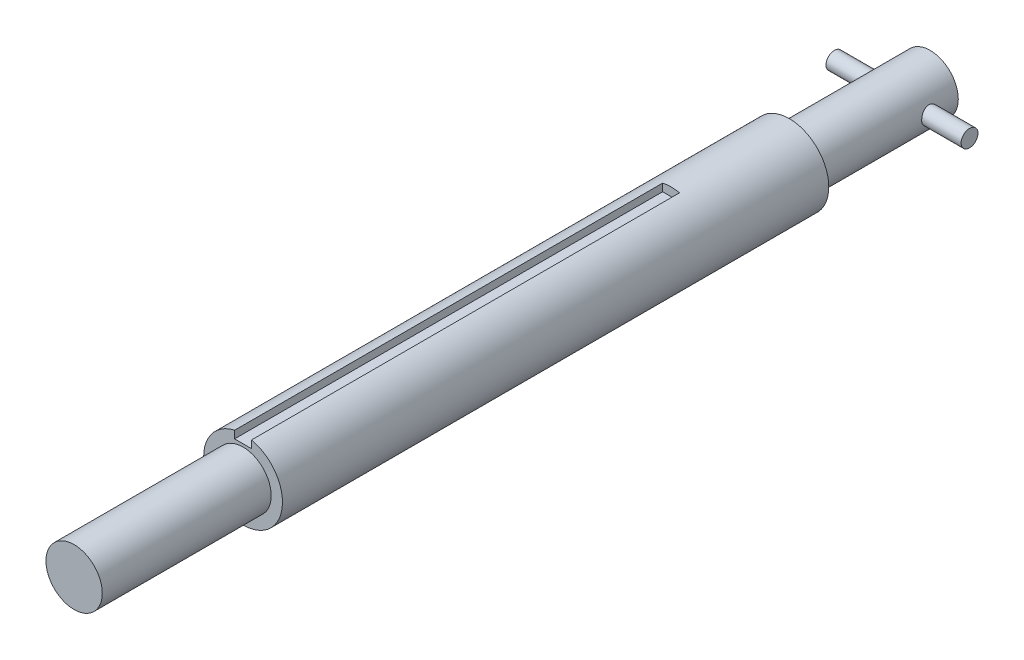
ISO-10303-21;
HEADER;
FILE_DESCRIPTION(('STEP AP214'),'2;1');
FILE_NAME('part.step','',(''),(''),'','','');
FILE_SCHEMA(('AUTOMOTIVE_DESIGN { 1 0 10303 214 1 1 1 1 }'));
ENDSEC;
DATA;
#1=APPLICATION_CONTEXT('core data for automotive mechanical design processes');
#2=APPLICATION_PROTOCOL_DEFINITION('international standard','automotive_design',2000,#1);
#3=PRODUCT_CONTEXT('',#1,'mechanical');
#4=PRODUCT('Part','Part','',(#3));
#5=PRODUCT_RELATED_PRODUCT_CATEGORY('part','',(#4));
#6=PRODUCT_DEFINITION_FORMATION('','',#4);
#7=PRODUCT_DEFINITION_CONTEXT('part definition',#1,'design');
#8=PRODUCT_DEFINITION('design','',#6,#7);
#9=PRODUCT_DEFINITION_SHAPE('','',#8);
#10=(LENGTH_UNIT() NAMED_UNIT(*) SI_UNIT(.MILLI.,.METRE.));
#11=(NAMED_UNIT(*) PLANE_ANGLE_UNIT() SI_UNIT($,.RADIAN.));
#12=(NAMED_UNIT(*) SI_UNIT($,.STERADIAN.) SOLID_ANGLE_UNIT());
#13=UNCERTAINTY_MEASURE_WITH_UNIT(LENGTH_MEASURE(1.E-05),#10,'distance_accuracy_value','');
#14=(GEOMETRIC_REPRESENTATION_CONTEXT(3) GLOBAL_UNCERTAINTY_ASSIGNED_CONTEXT((#13)) GLOBAL_UNIT_ASSIGNED_CONTEXT((#10,
#11,#12)) REPRESENTATION_CONTEXT('',''));
#15=CARTESIAN_POINT('',(0.,0.,0.));
#16=DIRECTION('',(0.,0.,1.));
#17=DIRECTION('',(1.,0.,0.));
#18=AXIS2_PLACEMENT_3D('',#15,#16,#17);
#19=CARTESIAN_POINT('',(-12.,0.,5.));
#20=DIRECTION('',(1.,0.,0.));
#21=DIRECTION('',(0.,0.,-1.));
#22=AXIS2_PLACEMENT_3D('',#19,#20,#21);
#23=CYLINDRICAL_SURFACE('',#22,1.5);
#24=CARTESIAN_POINT('',(-12.,0.,5.));
#25=DIRECTION('',(1.,0.,0.));
#26=DIRECTION('',(0.,0.,-1.));
#27=AXIS2_PLACEMENT_3D('',#24,#25,#26);
#28=CIRCLE('',#27,1.5);
#29=CARTESIAN_POINT('',(-12.,0.,3.5));
#30=VERTEX_POINT('',#29);
#31=EDGE_CURVE('E11',#30,#30,#28,.T.);
#32=ORIENTED_EDGE('',*,*,#31,.T.);
#33=EDGE_LOOP('',(#32));
#34=FACE_BOUND('',#33,.T.);
#35=CARTESIAN_POINT('',(12.,0.,5.));
#36=DIRECTION('',(1.,0.,0.));
#37=DIRECTION('',(0.,0.,-1.));
#38=AXIS2_PLACEMENT_3D('',#35,#36,#37);
#39=CIRCLE('',#38,1.5);
#40=CARTESIAN_POINT('',(12.,0.,3.5));
#41=VERTEX_POINT('',#40);
#42=EDGE_CURVE('E51',#41,#41,#39,.T.);
#43=ORIENTED_EDGE('',*,*,#42,.F.);
#44=EDGE_LOOP('',(#43));
#45=FACE_BOUND('',#44,.T.);
#46=ADVANCED_FACE('F45',(#34,#45),#23,.T.);
#47=CARTESIAN_POINT('',(-12.,0.,5.));
#48=DIRECTION('',(1.,0.,0.));
#49=DIRECTION('',(0.,0.,-1.));
#50=AXIS2_PLACEMENT_3D('',#47,#48,#49);
#51=PLANE('',#50);
#52=ORIENTED_EDGE('',*,*,#31,.F.);
#53=EDGE_LOOP('',(#52));
#54=FACE_BOUND('',#53,.T.);
#55=ADVANCED_FACE('F60',(#54),#51,.F.);
#56=CARTESIAN_POINT('',(12.,0.,5.));
#57=DIRECTION('',(1.,0.,0.));
#58=DIRECTION('',(0.,0.,-1.));
#59=AXIS2_PLACEMENT_3D('',#56,#57,#58);
#60=PLANE('',#59);
#61=ORIENTED_EDGE('',*,*,#42,.T.);
#62=EDGE_LOOP('',(#61));
#63=FACE_BOUND('',#62,.T.);
#64=ADVANCED_FACE('F57',(#63),#60,.T.);
#65=CLOSED_SHELL('',(#46,#55,#64));
#66=MANIFOLD_SOLID_BREP('B2',#65);
#67=CARTESIAN_POINT('',(0.,0.,25.));
#68=DIRECTION('',(0.,0.,-1.));
#69=DIRECTION('',(-1.,0.,0.));
#70=AXIS2_PLACEMENT_3D('',#67,#68,#69);
#71=CYLINDRICAL_SURFACE('',#70,5.);
#72=CARTESIAN_POINT('',(-5.,0.,6.5));
#73=CARTESIAN_POINT('',(-4.9999992925055,-0.0822886127532999,6.49999900251512));
#74=CARTESIAN_POINT('',(-4.99794915693953,-0.164587318351529,6.49320613637603));
#75=CARTESIAN_POINT('',(-4.98997105593691,-0.326788125304881,6.4662786457779));
#76=CARTESIAN_POINT('',(-4.98404193389692,-0.40668950441142,6.44614004197666));
#77=CARTESIAN_POINT('',(-4.96895552501836,-0.561732707754526,6.39325398308974));
#78=CARTESIAN_POINT('',(-4.95980300250425,-0.636881364395373,6.36052513038106));
#79=CARTESIAN_POINT('',(-4.93922109237645,-0.780624181053131,6.28346390694417));
#80=CARTESIAN_POINT('',(-4.92779140192067,-0.849217467469669,6.23912999260458));
#81=CARTESIAN_POINT('',(-4.90350737192774,-0.979871797183745,6.13877599252733));
#82=CARTESIAN_POINT('',(-4.89062383657036,-1.04171807124434,6.08248337411409));
#83=CARTESIAN_POINT('',(-4.86505834210442,-1.15524920923324,5.96039077008982));
#84=CARTESIAN_POINT('',(-4.85237641724501,-1.20693236327441,5.89458918787504));
#85=CARTESIAN_POINT('',(-4.82834113993772,-1.29980037723708,5.75352924696239));
#86=CARTESIAN_POINT('',(-4.81702406663875,-1.34072309022213,5.67809153900926));
#87=CARTESIAN_POINT('',(-4.79743620394031,-1.4092139477476,5.52101074576971));
#88=CARTESIAN_POINT('',(-4.78916468313311,-1.43678529919973,5.43936915607203));
#89=CARTESIAN_POINT('',(-4.77690870838434,-1.47701633682652,5.27460973386954));
#90=CARTESIAN_POINT('',(-4.77281069324533,-1.49007196234677,5.19159725613606));
#91=CARTESIAN_POINT('',(-4.76902789749767,-1.50213730614672,5.02446684378324));
#92=CARTESIAN_POINT('',(-4.76934204760571,-1.50115042761078,4.94034918194092));
#93=CARTESIAN_POINT('',(-4.77424744067778,-1.48546977199812,4.77661609139152));
#94=CARTESIAN_POINT('',(-4.7786838859914,-1.47127205262685,4.69694774963776));
#95=CARTESIAN_POINT('',(-4.79108356228624,-1.43037420427056,4.54118021372654));
#96=CARTESIAN_POINT('',(-4.7990471413235,-1.40367284141641,4.46508137262567));
#97=CARTESIAN_POINT('',(-4.81772733074973,-1.33816026653682,4.31739965033926));
#98=CARTESIAN_POINT('',(-4.82848016115952,-1.29918816934643,4.24589291604474));
#99=CARTESIAN_POINT('',(-4.85150987000064,-1.21035222588683,4.11026797798981));
#100=CARTESIAN_POINT('',(-4.86378711746991,-1.16048574002588,4.04615157058622));
#101=CARTESIAN_POINT('',(-4.88911011297937,-1.04881290765546,3.92431380923798));
#102=CARTESIAN_POINT('',(-4.90216654310498,-0.986594907466973,3.86697133597033));
#103=CARTESIAN_POINT('',(-4.92712244063258,-0.853263259313968,3.76344601593575));
#104=CARTESIAN_POINT('',(-4.9390218351841,-0.782149051860888,3.71726387158557));
#105=CARTESIAN_POINT('',(-4.9604316006947,-0.632355038342803,3.63714007753527));
#106=CARTESIAN_POINT('',(-4.96992543668314,-0.553627749747951,3.60328248375014));
#107=CARTESIAN_POINT('',(-4.98533521832222,-0.39124541560352,3.54940040990037));
#108=CARTESIAN_POINT('',(-4.99125216186999,-0.307591751589582,3.52937207146751));
#109=CARTESIAN_POINT('',(-4.99868364643538,-0.140952242668332,3.50434782210061));
#110=CARTESIAN_POINT('',(-5.0003485041779,-0.0580500976011875,3.49883841419839));
#111=CARTESIAN_POINT('',(-4.99952923241759,0.107499605823382,3.50156915571208));
#112=CARTESIAN_POINT('',(-4.99704565677756,0.19014719669078,3.50980746965144));
#113=CARTESIAN_POINT('',(-4.98830696987163,0.350903605309696,3.5393846111115));
#114=CARTESIAN_POINT('',(-4.98213829799417,0.429072772614169,3.56042338758087));
#115=CARTESIAN_POINT('',(-4.96674347841532,0.580754638954521,3.6146432327782));
#116=CARTESIAN_POINT('',(-4.95751696321085,0.654266777025583,3.64782576103786));
#117=CARTESIAN_POINT('',(-4.93669654351325,0.796437189461052,3.72625316548113));
#118=CARTESIAN_POINT('',(-4.92505280829675,0.86494382619967,3.77175934094797));
#119=CARTESIAN_POINT('',(-4.90073468764317,0.993523307980147,3.87322475405281));
#120=CARTESIAN_POINT('',(-4.8880600443108,1.05359403235593,3.92918661188767));
#121=CARTESIAN_POINT('',(-4.86253171869138,1.16585744551027,4.05238730836935));
#122=CARTESIAN_POINT('',(-4.84968825033268,1.21768481231503,4.11996187577174));
#123=CARTESIAN_POINT('',(-4.82576515238463,1.30928995072154,4.26312793901353));
#124=CARTESIAN_POINT('',(-4.81468547654651,1.34906803829472,4.33871922455821));
#125=CARTESIAN_POINT('',(-4.79567189615055,1.41517347127168,4.49553249125469));
#126=CARTESIAN_POINT('',(-4.78772337843827,1.4415634693705,4.57672618653659));
#127=CARTESIAN_POINT('',(-4.77591594362794,1.48021730815114,4.74268796893148));
#128=CARTESIAN_POINT('',(-4.772055625083,1.49248598978779,4.82745482078767));
#129=CARTESIAN_POINT('',(-4.76899972496087,1.50221984485059,4.99436151837623));
#130=CARTESIAN_POINT('',(-4.76961647442754,1.5002805530849,5.07646365101759));
#131=CARTESIAN_POINT('',(-4.77499401288294,1.48307505444813,5.2391141033728));
#132=CARTESIAN_POINT('',(-4.77975463592551,1.46780938124716,5.31966248517635));
#133=CARTESIAN_POINT('',(-4.79275763670385,1.42476888804136,5.47594539914285));
#134=CARTESIAN_POINT('',(-4.80095604545964,1.39715175507069,5.55172728736169));
#135=CARTESIAN_POINT('',(-4.81990278909136,1.33031507121129,5.69764243881772));
#136=CARTESIAN_POINT('',(-4.83065161194312,1.29109329962876,5.76777461764076));
#137=CARTESIAN_POINT('',(-4.85397676425833,1.20048763805072,5.90316311652711));
#138=CARTESIAN_POINT('',(-4.86660540163798,1.14871276092994,5.96814876126041));
#139=CARTESIAN_POINT('',(-4.89201320450026,1.03517434629782,6.08870249830786));
#140=CARTESIAN_POINT('',(-4.90479240823905,0.973408217134502,6.14426813946776));
#141=CARTESIAN_POINT('',(-4.92950936570649,0.83946576218325,6.24602341229503));
#142=CARTESIAN_POINT('',(-4.94141159765674,0.767037885790609,6.29189144685549));
#143=CARTESIAN_POINT('',(-4.96260680455813,0.61514137398353,6.37073516990403));
#144=CARTESIAN_POINT('',(-4.97190099931066,0.535676052998956,6.40371688827451));
#145=CARTESIAN_POINT('',(-4.98602174969301,0.380757712655282,6.45289527565275));
#146=CARTESIAN_POINT('',(-4.99122027381067,0.305786961954234,6.47051167288325));
#147=CARTESIAN_POINT('',(-4.99820944494492,0.15388019523078,6.49406352524158));
#148=CARTESIAN_POINT('',(-5.0000006615474,0.0769445098581397,6.50000093270482));
#149=CARTESIAN_POINT('',(-5.,0.,6.5));
#150=B_SPLINE_CURVE_WITH_KNOTS('',3,(#72,#73,#74,#75,#76,#77,#78,#79,#80,#81,#82,#83,#84,#85,
#86,#87,#88,#89,#90,#91,#92,#93,#94,#95,#96,#97,#98,#99,#100,#101,#102,#103,#104,#105,#106,#107,
#108,#109,#110,#111,#112,#113,#114,#115,#116,#117,#118,#119,#120,#121,#122,#123,#124,#125,#126,
#127,#128,#129,#130,#131,#132,#133,#134,#135,#136,#137,#138,#139,#140,#141,#142,#143,#144,#145,
#146,#147,#148,#149),.UNSPECIFIED.,.T.,.F.,(4,2,2,2,2,2,2,2,2,2,2,2,2,2,2,2,2,2,2,2,2,2,2,2,2,2,
2,2,2,2,2,2,2,2,2,2,2,2,4),(0.,0.24658320361261,0.493239964845999,0.739533676300874,
0.985860164412701,1.23855602948191,1.49129437288633,1.74971481004109,2.00807314543224,
2.25919689356599,2.51025978319089,2.75226016697676,2.99428443658001,3.2396242644712,
3.48502360158555,3.74067104048167,3.99633456531072,4.25371046881689,4.51101453528808,
4.75908809438545,5.00712853550327,5.24956746682327,5.49203554593729,5.74011305702909,
5.98825282000191,6.24540400322819,6.50254844252681,6.75847814951252,7.01432009460283,
7.25950155466943,7.504673196616,7.74680040402721,7.98897397553107,8.23996925679931,
8.49102974897503,8.74942996156671,9.00770911595235,9.2383169193046,9.46888616948875),.UNSPECIFIED.);
#151=CARTESIAN_POINT('',(-5.,0.,6.5));
#152=VERTEX_POINT('',#151);
#153=EDGE_CURVE('E96',#152,#152,#150,.T.);
#154=ORIENTED_EDGE('',*,*,#153,.T.);
#155=EDGE_LOOP('',(#154));
#156=FACE_BOUND('',#155,.T.);
#157=CARTESIAN_POINT('',(5.,0.,3.5));
#158=CARTESIAN_POINT('',(4.9999992925055,-0.0822886127533,3.50000099748489));
#159=CARTESIAN_POINT('',(4.99794915693953,-0.164587318351529,3.50679386362397));
#160=CARTESIAN_POINT('',(4.98997105593691,-0.326788125304881,3.5337213542221));
#161=CARTESIAN_POINT('',(4.98404193389692,-0.40668950441142,3.55385995802334));
#162=CARTESIAN_POINT('',(4.96895552501836,-0.561732707754527,3.60674601691026));
#163=CARTESIAN_POINT('',(4.95980300250425,-0.636881364395373,3.63947486961894));
#164=CARTESIAN_POINT('',(4.93922109237645,-0.780624181053132,3.71653609305584));
#165=CARTESIAN_POINT('',(4.92779140192067,-0.84921746746967,3.76087000739542));
#166=CARTESIAN_POINT('',(4.90350737192774,-0.979871797183745,3.86122400747267));
#167=CARTESIAN_POINT('',(4.89062383657036,-1.04171807124434,3.91751662588591));
#168=CARTESIAN_POINT('',(4.86505834210442,-1.15524920923324,4.03960922991018));
#169=CARTESIAN_POINT('',(4.85237641724501,-1.20693236327441,4.10541081212496));
#170=CARTESIAN_POINT('',(4.82834113993772,-1.29980037723708,4.24647075303761));
#171=CARTESIAN_POINT('',(4.81702406663875,-1.34072309022213,4.32190846099074));
#172=CARTESIAN_POINT('',(4.79743620394031,-1.4092139477476,4.47898925423029));
#173=CARTESIAN_POINT('',(4.78916468313311,-1.43678529919973,4.56063084392798));
#174=CARTESIAN_POINT('',(4.77690870838434,-1.47701633682652,4.72539026613046));
#175=CARTESIAN_POINT('',(4.77281069324533,-1.49007196234677,4.80840274386394));
#176=CARTESIAN_POINT('',(4.76902789749767,-1.50213730614672,4.97553315621677));
#177=CARTESIAN_POINT('',(4.76934204760571,-1.50115042761078,5.05965081805909));
#178=CARTESIAN_POINT('',(4.77424744067778,-1.48546977199812,5.22338390860848));
#179=CARTESIAN_POINT('',(4.7786838859914,-1.47127205262685,5.30305225036224));
#180=CARTESIAN_POINT('',(4.79108356228624,-1.43037420427056,5.45881978627346));
#181=CARTESIAN_POINT('',(4.7990471413235,-1.40367284141641,5.53491862737433));
#182=CARTESIAN_POINT('',(4.81772733074973,-1.33816026653682,5.68260034966074));
#183=CARTESIAN_POINT('',(4.82848016115952,-1.29918816934643,5.75410708395526));
#184=CARTESIAN_POINT('',(4.85150987000064,-1.21035222588683,5.88973202201019));
#185=CARTESIAN_POINT('',(4.86378711746991,-1.16048574002588,5.95384842941378));
#186=CARTESIAN_POINT('',(4.88911011297937,-1.04881290765546,6.07568619076202));
#187=CARTESIAN_POINT('',(4.90216654310498,-0.986594907466972,6.13302866402967));
#188=CARTESIAN_POINT('',(4.92712244063258,-0.853263259313967,6.23655398406425));
#189=CARTESIAN_POINT('',(4.9390218351841,-0.782149051860888,6.28273612841443));
#190=CARTESIAN_POINT('',(4.9604316006947,-0.632355038342803,6.36285992246473));
#191=CARTESIAN_POINT('',(4.96992543668314,-0.553627749747951,6.39671751624986));
#192=CARTESIAN_POINT('',(4.98533521832222,-0.391245415603519,6.45059959009963));
#193=CARTESIAN_POINT('',(4.99125216186999,-0.307591751589582,6.47062792853249));
#194=CARTESIAN_POINT('',(4.99868364643538,-0.140952242668332,6.4956521778994));
#195=CARTESIAN_POINT('',(5.0003485041779,-0.0580500976011873,6.50116158580161));
#196=CARTESIAN_POINT('',(4.99952923241759,0.107499605823383,6.49843084428792));
#197=CARTESIAN_POINT('',(4.99704565677756,0.19014719669078,6.49019253034856));
#198=CARTESIAN_POINT('',(4.98830696987163,0.350903605309697,6.46061538888851));
#199=CARTESIAN_POINT('',(4.98213829799417,0.429072772614169,6.43957661241913));
#200=CARTESIAN_POINT('',(4.96674347841532,0.580754638954522,6.3853567672218));
#201=CARTESIAN_POINT('',(4.95751696321085,0.654266777025584,6.35217423896214));
#202=CARTESIAN_POINT('',(4.93669654351325,0.796437189461053,6.27374683451887));
#203=CARTESIAN_POINT('',(4.92505280829675,0.86494382619967,6.22824065905203));
#204=CARTESIAN_POINT('',(4.90073468764317,0.993523307980147,6.12677524594719));
#205=CARTESIAN_POINT('',(4.8880600443108,1.05359403235594,6.07081338811233));
#206=CARTESIAN_POINT('',(4.86253171869138,1.16585744551027,5.94761269163066));
#207=CARTESIAN_POINT('',(4.84968825033268,1.21768481231503,5.88003812422827));
#208=CARTESIAN_POINT('',(4.82576515238463,1.30928995072154,5.73687206098647));
#209=CARTESIAN_POINT('',(4.81468547654651,1.34906803829472,5.66128077544179));
#210=CARTESIAN_POINT('',(4.79567189615055,1.41517347127168,5.50446750874531));
#211=CARTESIAN_POINT('',(4.78772337843827,1.4415634693705,5.42327381346341));
#212=CARTESIAN_POINT('',(4.77591594362794,1.48021730815114,5.25731203106852));
#213=CARTESIAN_POINT('',(4.772055625083,1.49248598978779,5.17254517921233));
#214=CARTESIAN_POINT('',(4.76899972496087,1.50221984485059,5.00563848162377));
#215=CARTESIAN_POINT('',(4.76961647442754,1.5002805530849,4.92353634898241));
#216=CARTESIAN_POINT('',(4.77499401288294,1.48307505444813,4.7608858966272));
#217=CARTESIAN_POINT('',(4.77975463592551,1.46780938124716,4.68033751482365));
#218=CARTESIAN_POINT('',(4.79275763670385,1.42476888804136,4.52405460085715));
#219=CARTESIAN_POINT('',(4.80095604545965,1.39715175507068,4.44827271263831));
#220=CARTESIAN_POINT('',(4.81990278909136,1.33031507121129,4.30235756118228));
#221=CARTESIAN_POINT('',(4.83065161194312,1.29109329962876,4.23222538235924));
#222=CARTESIAN_POINT('',(4.85397676425833,1.20048763805072,4.09683688347289));
#223=CARTESIAN_POINT('',(4.86660540163797,1.14871276092994,4.03185123873959));
#224=CARTESIAN_POINT('',(4.89201320450026,1.03517434629782,3.91129750169214));
#225=CARTESIAN_POINT('',(4.90479240823905,0.973408217134501,3.85573186053224));
#226=CARTESIAN_POINT('',(4.92950936570649,0.839465762183249,3.75397658770497));
#227=CARTESIAN_POINT('',(4.94141159765674,0.767037885790608,3.70810855314451));
#228=CARTESIAN_POINT('',(4.96260680455813,0.61514137398353,3.62926483009598));
#229=CARTESIAN_POINT('',(4.97190099931066,0.535676052998955,3.59628311172549));
#230=CARTESIAN_POINT('',(4.98602174969301,0.380757712655282,3.54710472434725));
#231=CARTESIAN_POINT('',(4.99122027381067,0.305786961954234,3.52948832711675));
#232=CARTESIAN_POINT('',(4.99820944494492,0.15388019523078,3.50593647475842));
#233=CARTESIAN_POINT('',(5.0000006615474,0.0769445098581397,3.49999906729518));
#234=CARTESIAN_POINT('',(5.,0.,3.5));
#235=B_SPLINE_CURVE_WITH_KNOTS('',3,(#157,#158,#159,#160,#161,#162,#163,#164,#165,#166,#167,
#168,#169,#170,#171,#172,#173,#174,#175,#176,#177,#178,#179,#180,#181,#182,#183,#184,#185,#186,
#187,#188,#189,#190,#191,#192,#193,#194,#195,#196,#197,#198,#199,#200,#201,#202,#203,#204,#205,
#206,#207,#208,#209,#210,#211,#212,#213,#214,#215,#216,#217,#218,#219,#220,#221,#222,#223,#224,
#225,#226,#227,#228,#229,#230,#231,#232,#233,#234),.UNSPECIFIED.,.T.,.F.,(4,2,2,2,2,2,2,2,2,2,2,
2,2,2,2,2,2,2,2,2,2,2,2,2,2,2,2,2,2,2,2,2,2,2,2,2,2,2,4),(0.,0.246583203612611,0.493239964846,
0.739533676300874,0.985860164412702,1.23855602948191,1.49129437288633,1.74971481004109,
2.00807314543224,2.25919689356599,2.51025978319089,2.75226016697676,2.99428443658001,
3.2396242644712,3.48502360158556,3.74067104048167,3.99633456531072,4.25371046881689,
4.51101453528808,4.75908809438545,5.00712853550327,5.24956746682327,5.49203554593729,
5.74011305702909,5.98825282000191,6.24540400322818,6.50254844252681,6.75847814951252,
7.01432009460283,7.25950155466943,7.504673196616,7.74680040402721,7.98897397553107,
8.23996925679931,8.49102974897503,8.74942996156671,9.00770911595235,9.2383169193046,
9.46888616948875),.UNSPECIFIED.);
#236=CARTESIAN_POINT('',(5.,0.,3.5));
#237=VERTEX_POINT('',#236);
#238=EDGE_CURVE('E185',#237,#237,#235,.T.);
#239=ORIENTED_EDGE('',*,*,#238,.T.);
#240=EDGE_LOOP('',(#239));
#241=FACE_BOUND('',#240,.T.);
#242=CARTESIAN_POINT('',(0.,0.,25.));
#243=DIRECTION('',(0.,0.,1.));
#244=DIRECTION('',(1.,0.,0.));
#245=AXIS2_PLACEMENT_3D('',#242,#243,#244);
#246=CIRCLE('',#245,5.);
#247=CARTESIAN_POINT('',(5.,0.,25.));
#248=VERTEX_POINT('',#247);
#249=EDGE_CURVE('E177',#248,#248,#246,.T.);
#250=ORIENTED_EDGE('',*,*,#249,.F.);
#251=EDGE_LOOP('',(#250));
#252=FACE_BOUND('',#251,.T.);
#253=CARTESIAN_POINT('',(0.,0.,0.));
#254=DIRECTION('',(0.,0.,1.));
#255=DIRECTION('',(1.,0.,0.));
#256=AXIS2_PLACEMENT_3D('',#253,#254,#255);
#257=CIRCLE('',#256,5.);
#258=CARTESIAN_POINT('',(5.,0.,0.));
#259=VERTEX_POINT('',#258);
#260=EDGE_CURVE('E179',#259,#259,#257,.T.);
#261=ORIENTED_EDGE('',*,*,#260,.T.);
#262=EDGE_LOOP('',(#261));
#263=FACE_BOUND('',#262,.T.);
#264=ADVANCED_FACE('F92',(#156,#241,#252,#263),#71,.T.);
#265=CARTESIAN_POINT('',(0.,0.,0.));
#266=DIRECTION('',(0.,0.,1.));
#267=DIRECTION('',(1.,0.,0.));
#268=AXIS2_PLACEMENT_3D('',#265,#266,#267);
#269=PLANE('',#268);
#270=ORIENTED_EDGE('',*,*,#260,.F.);
#271=EDGE_LOOP('',(#270));
#272=FACE_BOUND('',#271,.T.);
#273=ADVANCED_FACE('F223',(#272),#269,.F.);
#274=CARTESIAN_POINT('',(0.,0.,122.));
#275=DIRECTION('',(0.,0.,-1.));
#276=DIRECTION('',(-1.,0.,0.));
#277=AXIS2_PLACEMENT_3D('',#274,#275,#276);
#278=CYLINDRICAL_SURFACE('',#277,7.);
#279=CARTESIAN_POINT('',(0.,0.,122.));
#280=DIRECTION('',(0.,0.,1.));
#281=DIRECTION('',(1.,0.,0.));
#282=AXIS2_PLACEMENT_3D('',#279,#280,#281);
#283=CIRCLE('',#282,7.);
#284=CARTESIAN_POINT('',(-1.49999999999999,6.83739716558867,122.));
#285=VERTEX_POINT('',#284);
#286=CARTESIAN_POINT('',(1.49999999999999,6.83739716558867,122.));
#287=VERTEX_POINT('',#286);
#288=EDGE_CURVE('E160',#285,#287,#283,.T.);
#289=ORIENTED_EDGE('',*,*,#288,.F.);
#290=DIRECTION('',(0.,0.,-1.));
#291=VECTOR('',#290,1.);
#292=CARTESIAN_POINT('',(-1.49999999999999,6.83739716558867,122.));
#293=LINE('',#292,#291);
#294=CARTESIAN_POINT('',(-1.50000000000002,6.83739716558867,46.));
#295=VERTEX_POINT('',#294);
#296=EDGE_CURVE('E120',#285,#295,#293,.T.);
#297=ORIENTED_EDGE('',*,*,#296,.T.);
#298=CARTESIAN_POINT('',(0.,0.,46.));
#299=DIRECTION('',(0.,0.,-1.));
#300=DIRECTION('',(-1.,0.,0.));
#301=AXIS2_PLACEMENT_3D('',#298,#299,#300);
#302=CIRCLE('',#301,7.);
#303=CARTESIAN_POINT('',(1.49999999999998,6.83739716558867,46.));
#304=VERTEX_POINT('',#303);
#305=EDGE_CURVE('E43',#295,#304,#302,.T.);
#306=ORIENTED_EDGE('',*,*,#305,.T.);
#307=DIRECTION('',(0.,0.,-1.));
#308=VECTOR('',#307,1.);
#309=CARTESIAN_POINT('',(1.49999999999999,6.83739716558867,122.));
#310=LINE('',#309,#308);
#311=EDGE_CURVE('E168',#304,#287,#310,.F.);
#312=ORIENTED_EDGE('',*,*,#311,.T.);
#313=EDGE_LOOP('',(#289,#297,#306,#312));
#314=FACE_BOUND('',#313,.T.);
#315=CARTESIAN_POINT('',(0.,0.,25.));
#316=DIRECTION('',(0.,0.,1.));
#317=DIRECTION('',(1.,0.,0.));
#318=AXIS2_PLACEMENT_3D('',#315,#316,#317);
#319=CIRCLE('',#318,7.);
#320=CARTESIAN_POINT('',(7.,0.,25.));
#321=VERTEX_POINT('',#320);
#322=EDGE_CURVE('E174',#321,#321,#319,.T.);
#323=ORIENTED_EDGE('',*,*,#322,.T.);
#324=EDGE_LOOP('',(#323));
#325=FACE_BOUND('',#324,.T.);
#326=ADVANCED_FACE('F218',(#314,#325),#278,.T.);
#327=CARTESIAN_POINT('',(0.,0.,122.));
#328=DIRECTION('',(0.,0.,1.));
#329=DIRECTION('',(1.,0.,0.));
#330=AXIS2_PLACEMENT_3D('',#327,#328,#329);
#331=PLANE('',#330);
#332=DIRECTION('',(0.,1.,0.));
#333=VECTOR('',#332,1.);
#334=CARTESIAN_POINT('',(-1.49999999999999,5.5,122.));
#335=LINE('',#334,#333);
#336=CARTESIAN_POINT('',(-1.50000000000002,5.5,122.));
#337=VERTEX_POINT('',#336);
#338=EDGE_CURVE('E161',#337,#285,#335,.T.);
#339=ORIENTED_EDGE('',*,*,#338,.T.);
#340=ORIENTED_EDGE('',*,*,#288,.T.);
#341=DIRECTION('',(0.,1.,0.));
#342=VECTOR('',#341,1.);
#343=CARTESIAN_POINT('',(1.49999999999999,5.5,122.));
#344=LINE('',#343,#342);
#345=CARTESIAN_POINT('',(1.49999999999999,5.5,122.));
#346=VERTEX_POINT('',#345);
#347=EDGE_CURVE('E144',#346,#287,#344,.T.);
#348=ORIENTED_EDGE('',*,*,#347,.F.);
#349=DIRECTION('',(1.,0.,0.));
#350=VECTOR('',#349,1.);
#351=CARTESIAN_POINT('',(-1.49999999999999,5.5,122.));
#352=LINE('',#351,#350);
#353=EDGE_CURVE('E150',#337,#346,#352,.T.);
#354=ORIENTED_EDGE('',*,*,#353,.F.);
#355=EDGE_LOOP('',(#339,#340,#348,#354));
#356=FACE_BOUND('',#355,.T.);
#357=CARTESIAN_POINT('',(0.,0.,122.));
#358=DIRECTION('',(0.,0.,1.));
#359=DIRECTION('',(1.,0.,0.));
#360=AXIS2_PLACEMENT_3D('',#357,#358,#359);
#361=CIRCLE('',#360,5.);
#362=CARTESIAN_POINT('',(5.,0.,122.));
#363=VERTEX_POINT('',#362);
#364=EDGE_CURVE('E105',#363,#363,#361,.T.);
#365=ORIENTED_EDGE('',*,*,#364,.F.);
#366=EDGE_LOOP('',(#365));
#367=FACE_BOUND('',#366,.T.);
#368=ADVANCED_FACE('F157',(#356,#367),#331,.T.);
#369=CARTESIAN_POINT('',(0.,0.,25.));
#370=DIRECTION('',(0.,0.,1.));
#371=DIRECTION('',(1.,0.,0.));
#372=AXIS2_PLACEMENT_3D('',#369,#370,#371);
#373=PLANE('',#372);
#374=ORIENTED_EDGE('',*,*,#249,.T.);
#375=EDGE_LOOP('',(#374));
#376=FACE_BOUND('',#375,.T.);
#377=ORIENTED_EDGE('',*,*,#322,.F.);
#378=EDGE_LOOP('',(#377));
#379=FACE_BOUND('',#378,.T.);
#380=ADVANCED_FACE('F214',(#376,#379),#373,.F.);
#381=CARTESIAN_POINT('',(0.,0.,152.));
#382=DIRECTION('',(0.,0.,-1.));
#383=DIRECTION('',(-1.,0.,0.));
#384=AXIS2_PLACEMENT_3D('',#381,#382,#383);
#385=CYLINDRICAL_SURFACE('',#384,5.);
#386=CARTESIAN_POINT('',(0.,0.,152.));
#387=DIRECTION('',(0.,0.,1.));
#388=DIRECTION('',(1.,0.,0.));
#389=AXIS2_PLACEMENT_3D('',#386,#387,#388);
#390=CIRCLE('',#389,5.);
#391=CARTESIAN_POINT('',(5.,0.,152.));
#392=VERTEX_POINT('',#391);
#393=EDGE_CURVE('E171',#392,#392,#390,.T.);
#394=ORIENTED_EDGE('',*,*,#393,.F.);
#395=EDGE_LOOP('',(#394));
#396=FACE_BOUND('',#395,.T.);
#397=ORIENTED_EDGE('',*,*,#364,.T.);
#398=EDGE_LOOP('',(#397));
#399=FACE_BOUND('',#398,.T.);
#400=ADVANCED_FACE('F210',(#396,#399),#385,.T.);
#401=CARTESIAN_POINT('',(0.,0.,152.));
#402=DIRECTION('',(0.,0.,1.));
#403=DIRECTION('',(1.,0.,0.));
#404=AXIS2_PLACEMENT_3D('',#401,#402,#403);
#405=PLANE('',#404);
#406=ORIENTED_EDGE('',*,*,#393,.T.);
#407=EDGE_LOOP('',(#406));
#408=FACE_BOUND('',#407,.T.);
#409=ADVANCED_FACE('F202',(#408),#405,.T.);
#410=CARTESIAN_POINT('',(-1.50000000000002,5.5,46.));
#411=DIRECTION('',(0.,0.,-1.));
#412=DIRECTION('',(-1.,0.,0.));
#413=AXIS2_PLACEMENT_3D('',#410,#411,#412);
#414=PLANE('',#413);
#415=DIRECTION('',(0.,1.,0.));
#416=VECTOR('',#415,1.);
#417=CARTESIAN_POINT('',(-1.50000000000002,5.5,46.));
#418=LINE('',#417,#416);
#419=CARTESIAN_POINT('',(-1.50000000000002,5.5,46.));
#420=VERTEX_POINT('',#419);
#421=EDGE_CURVE('E163',#420,#295,#418,.T.);
#422=ORIENTED_EDGE('',*,*,#421,.F.);
#423=DIRECTION('',(-1.,0.,0.));
#424=VECTOR('',#423,1.);
#425=CARTESIAN_POINT('',(-1.50000000000002,5.5,46.));
#426=LINE('',#425,#424);
#427=CARTESIAN_POINT('',(1.49999999999998,5.5,46.));
#428=VERTEX_POINT('',#427);
#429=EDGE_CURVE('E149',#428,#420,#426,.T.);
#430=ORIENTED_EDGE('',*,*,#429,.F.);
#431=DIRECTION('',(0.,1.,0.));
#432=VECTOR('',#431,1.);
#433=CARTESIAN_POINT('',(1.49999999999998,5.5,46.));
#434=LINE('',#433,#432);
#435=EDGE_CURVE('E147',#428,#304,#434,.T.);
#436=ORIENTED_EDGE('',*,*,#435,.T.);
#437=ORIENTED_EDGE('',*,*,#305,.F.);
#438=EDGE_LOOP('',(#422,#430,#436,#437));
#439=FACE_BOUND('',#438,.T.);
#440=ADVANCED_FACE('F198',(#439),#414,.F.);
#441=CARTESIAN_POINT('',(-1.50000000000002,5.5,46.));
#442=DIRECTION('',(-1.,0.,0.));
#443=DIRECTION('',(0.,0.,1.));
#444=AXIS2_PLACEMENT_3D('',#441,#442,#443);
#445=PLANE('',#444);
#446=ORIENTED_EDGE('',*,*,#338,.F.);
#447=DIRECTION('',(0.,0.,1.));
#448=VECTOR('',#447,1.);
#449=CARTESIAN_POINT('',(-1.50000000000002,5.5,46.));
#450=LINE('',#449,#448);
#451=EDGE_CURVE('E113',#420,#337,#450,.T.);
#452=ORIENTED_EDGE('',*,*,#451,.F.);
#453=ORIENTED_EDGE('',*,*,#421,.T.);
#454=ORIENTED_EDGE('',*,*,#296,.F.);
#455=EDGE_LOOP('',(#446,#452,#453,#454));
#456=FACE_BOUND('',#455,.T.);
#457=ADVANCED_FACE('F201',(#456),#445,.F.);
#458=CARTESIAN_POINT('',(1.49999999999998,5.5,46.));
#459=DIRECTION('',(1.,0.,0.));
#460=DIRECTION('',(0.,0.,-1.));
#461=AXIS2_PLACEMENT_3D('',#458,#459,#460);
#462=PLANE('',#461);
#463=ORIENTED_EDGE('',*,*,#435,.F.);
#464=DIRECTION('',(0.,0.,-1.));
#465=VECTOR('',#464,1.);
#466=CARTESIAN_POINT('',(1.49999999999998,5.5,46.));
#467=LINE('',#466,#465);
#468=EDGE_CURVE('E141',#346,#428,#467,.T.);
#469=ORIENTED_EDGE('',*,*,#468,.F.);
#470=ORIENTED_EDGE('',*,*,#347,.T.);
#471=ORIENTED_EDGE('',*,*,#311,.F.);
#472=EDGE_LOOP('',(#463,#469,#470,#471));
#473=FACE_BOUND('',#472,.T.);
#474=ADVANCED_FACE('F142',(#473),#462,.F.);
#475=CARTESIAN_POINT('',(0.,5.5,0.));
#476=DIRECTION('',(0.,1.,0.));
#477=DIRECTION('',(0.,0.,1.));
#478=AXIS2_PLACEMENT_3D('',#475,#476,#477);
#479=PLANE('',#478);
#480=ORIENTED_EDGE('',*,*,#451,.T.);
#481=ORIENTED_EDGE('',*,*,#353,.T.);
#482=ORIENTED_EDGE('',*,*,#468,.T.);
#483=ORIENTED_EDGE('',*,*,#429,.T.);
#484=EDGE_LOOP('',(#480,#481,#482,#483));
#485=FACE_BOUND('',#484,.T.);
#486=ADVANCED_FACE('F153',(#485),#479,.T.);
#487=CARTESIAN_POINT('',(-7.,0.,5.));
#488=DIRECTION('',(1.,0.,0.));
#489=DIRECTION('',(0.,0.,-1.));
#490=AXIS2_PLACEMENT_3D('',#487,#488,#489);
#491=CYLINDRICAL_SURFACE('',#490,1.5);
#492=ORIENTED_EDGE('',*,*,#238,.F.);
#493=EDGE_LOOP('',(#492));
#494=FACE_BOUND('',#493,.T.);
#495=ORIENTED_EDGE('',*,*,#153,.F.);
#496=EDGE_LOOP('',(#495));
#497=FACE_BOUND('',#496,.T.);
#498=ADVANCED_FACE('F190',(#494,#497),#491,.F.);
#499=CLOSED_SHELL('',(#264,#273,#326,#368,#380,#400,#409,#440,#457,#474,#486,#498));
#500=MANIFOLD_SOLID_BREP('B6',#499);
#501=ADVANCED_BREP_SHAPE_REPRESENTATION('',(#18,#66,#500),#14);
#502=SHAPE_DEFINITION_REPRESENTATION(#9,#501);
ENDSEC;
END-ISO-10303-21;
